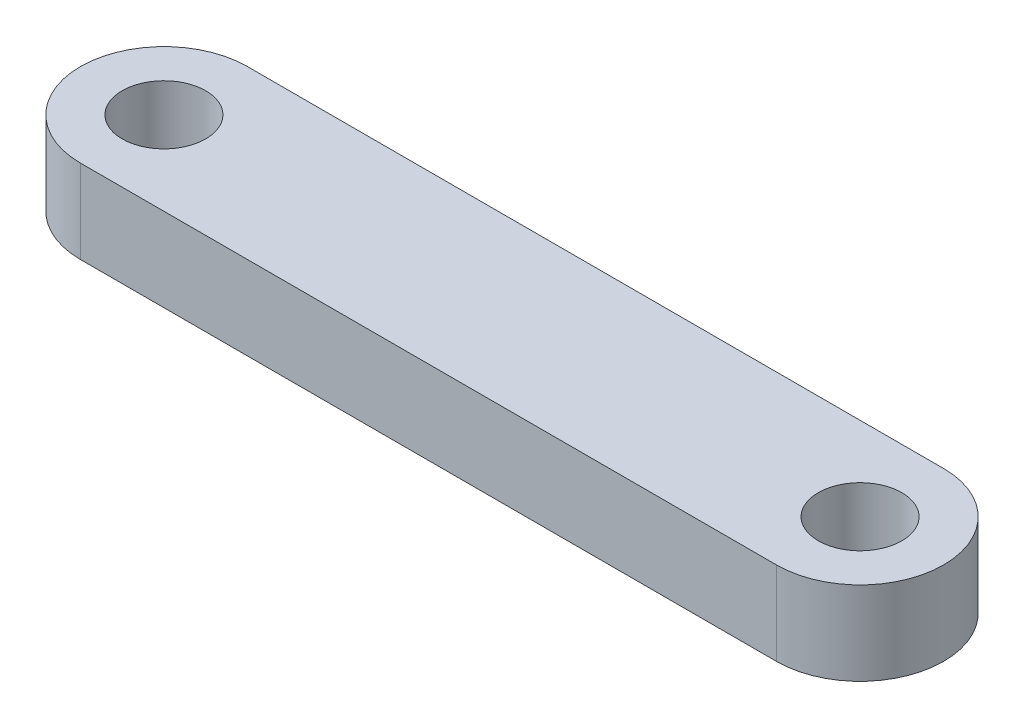
ISO-10303-21;
HEADER;
FILE_DESCRIPTION(('STEP AP214'),'2;1');
FILE_NAME('part.step','',(''),(''),'','','');
FILE_SCHEMA(('AUTOMOTIVE_DESIGN { 1 0 10303 214 1 1 1 1 }'));
ENDSEC;
DATA;
#1=APPLICATION_CONTEXT('core data for automotive mechanical design processes');
#2=APPLICATION_PROTOCOL_DEFINITION('international standard','automotive_design',2000,#1);
#3=PRODUCT_CONTEXT('',#1,'mechanical');
#4=PRODUCT('Part','Part','',(#3));
#5=PRODUCT_RELATED_PRODUCT_CATEGORY('part','',(#4));
#6=PRODUCT_DEFINITION_FORMATION('','',#4);
#7=PRODUCT_DEFINITION_CONTEXT('part definition',#1,'design');
#8=PRODUCT_DEFINITION('design','',#6,#7);
#9=PRODUCT_DEFINITION_SHAPE('','',#8);
#10=(LENGTH_UNIT() NAMED_UNIT(*) SI_UNIT(.MILLI.,.METRE.));
#11=(NAMED_UNIT(*) PLANE_ANGLE_UNIT() SI_UNIT($,.RADIAN.));
#12=(NAMED_UNIT(*) SI_UNIT($,.STERADIAN.) SOLID_ANGLE_UNIT());
#13=UNCERTAINTY_MEASURE_WITH_UNIT(LENGTH_MEASURE(1.E-05),#10,'distance_accuracy_value','');
#14=(GEOMETRIC_REPRESENTATION_CONTEXT(3) GLOBAL_UNCERTAINTY_ASSIGNED_CONTEXT((#13)) GLOBAL_UNIT_ASSIGNED_CONTEXT((#10,
#11,#12)) REPRESENTATION_CONTEXT('',''));
#15=CARTESIAN_POINT('',(0.,0.,0.));
#16=DIRECTION('',(0.,0.,1.));
#17=DIRECTION('',(1.,0.,0.));
#18=AXIS2_PLACEMENT_3D('',#15,#16,#17);
#19=CARTESIAN_POINT('',(0.,3.,-12.5));
#20=DIRECTION('',(0.,1.,0.));
#21=DIRECTION('',(0.,0.,1.));
#22=AXIS2_PLACEMENT_3D('',#19,#20,#21);
#23=PLANE('',#22);
#24=CARTESIAN_POINT('',(25.,3.,-12.5));
#25=DIRECTION('',(0.,1.,0.));
#26=DIRECTION('',(0.,0.,1.));
#27=AXIS2_PLACEMENT_3D('',#24,#25,#26);
#28=CIRCLE('',#27,1.5);
#29=CARTESIAN_POINT('',(25.,3.,-11.));
#30=VERTEX_POINT('',#29);
#31=EDGE_CURVE('E100',#30,#30,#28,.T.);
#32=ORIENTED_EDGE('',*,*,#31,.F.);
#33=EDGE_LOOP('',(#32));
#34=FACE_BOUND('',#33,.T.);
#35=CARTESIAN_POINT('',(0.,3.,-12.5));
#36=DIRECTION('',(0.,1.,0.));
#37=DIRECTION('',(0.,0.,1.));
#38=AXIS2_PLACEMENT_3D('',#35,#36,#37);
#39=CIRCLE('',#38,3.);
#40=CARTESIAN_POINT('',(0.,3.,-15.5));
#41=VERTEX_POINT('',#40);
#42=CARTESIAN_POINT('',(0.,3.,-9.5));
#43=VERTEX_POINT('',#42);
#44=EDGE_CURVE('E85',#41,#43,#39,.T.);
#45=ORIENTED_EDGE('',*,*,#44,.T.);
#46=DIRECTION('',(1.,0.,0.));
#47=VECTOR('',#46,1.);
#48=CARTESIAN_POINT('',(0.,3.,-9.5));
#49=LINE('',#48,#47);
#50=CARTESIAN_POINT('',(25.,3.,-9.5));
#51=VERTEX_POINT('',#50);
#52=EDGE_CURVE('E80',#43,#51,#49,.T.);
#53=ORIENTED_EDGE('',*,*,#52,.T.);
#54=CARTESIAN_POINT('',(25.,3.,-12.5));
#55=DIRECTION('',(0.,1.,0.));
#56=DIRECTION('',(0.,0.,1.));
#57=AXIS2_PLACEMENT_3D('',#54,#55,#56);
#58=CIRCLE('',#57,3.);
#59=CARTESIAN_POINT('',(25.,3.,-15.5));
#60=VERTEX_POINT('',#59);
#61=EDGE_CURVE('E83',#51,#60,#58,.T.);
#62=ORIENTED_EDGE('',*,*,#61,.T.);
#63=DIRECTION('',(-1.,0.,0.));
#64=VECTOR('',#63,1.);
#65=CARTESIAN_POINT('',(0.,3.,-15.5));
#66=LINE('',#65,#64);
#67=EDGE_CURVE('E50',#60,#41,#66,.T.);
#68=ORIENTED_EDGE('',*,*,#67,.T.);
#69=EDGE_LOOP('',(#45,#53,#62,#68));
#70=FACE_BOUND('',#69,.T.);
#71=CARTESIAN_POINT('',(0.,3.,-12.5));
#72=DIRECTION('',(0.,1.,0.));
#73=DIRECTION('',(0.,0.,1.));
#74=AXIS2_PLACEMENT_3D('',#71,#72,#73);
#75=CIRCLE('',#74,1.5);
#76=CARTESIAN_POINT('',(0.,3.,-11.));
#77=VERTEX_POINT('',#76);
#78=EDGE_CURVE('E115',#77,#77,#75,.T.);
#79=ORIENTED_EDGE('',*,*,#78,.F.);
#80=EDGE_LOOP('',(#79));
#81=FACE_BOUND('',#80,.T.);
#82=ADVANCED_FACE('F33',(#34,#70,#81),#23,.T.);
#83=CARTESIAN_POINT('',(0.,0.,-12.5));
#84=DIRECTION('',(0.,1.,0.));
#85=DIRECTION('',(0.,0.,1.));
#86=AXIS2_PLACEMENT_3D('',#83,#84,#85);
#87=PLANE('',#86);
#88=CARTESIAN_POINT('',(0.,0.,-12.5));
#89=DIRECTION('',(0.,1.,0.));
#90=DIRECTION('',(0.,0.,1.));
#91=AXIS2_PLACEMENT_3D('',#88,#89,#90);
#92=CIRCLE('',#91,3.);
#93=CARTESIAN_POINT('',(0.,0.,-15.5));
#94=VERTEX_POINT('',#93);
#95=CARTESIAN_POINT('',(0.,0.,-9.5));
#96=VERTEX_POINT('',#95);
#97=EDGE_CURVE('E97',#94,#96,#92,.T.);
#98=ORIENTED_EDGE('',*,*,#97,.F.);
#99=DIRECTION('',(-1.,0.,0.));
#100=VECTOR('',#99,1.);
#101=CARTESIAN_POINT('',(0.,0.,-15.5));
#102=LINE('',#101,#100);
#103=CARTESIAN_POINT('',(25.,0.,-15.5));
#104=VERTEX_POINT('',#103);
#105=EDGE_CURVE('E73',#104,#94,#102,.T.);
#106=ORIENTED_EDGE('',*,*,#105,.F.);
#107=CARTESIAN_POINT('',(25.,0.,-12.5));
#108=DIRECTION('',(0.,1.,0.));
#109=DIRECTION('',(0.,0.,1.));
#110=AXIS2_PLACEMENT_3D('',#107,#108,#109);
#111=CIRCLE('',#110,3.);
#112=CARTESIAN_POINT('',(25.,0.,-9.5));
#113=VERTEX_POINT('',#112);
#114=EDGE_CURVE('E67',#113,#104,#111,.T.);
#115=ORIENTED_EDGE('',*,*,#114,.F.);
#116=DIRECTION('',(1.,0.,0.));
#117=VECTOR('',#116,1.);
#118=CARTESIAN_POINT('',(0.,0.,-9.5));
#119=LINE('',#118,#117);
#120=EDGE_CURVE('E89',#96,#113,#119,.T.);
#121=ORIENTED_EDGE('',*,*,#120,.F.);
#122=EDGE_LOOP('',(#98,#106,#115,#121));
#123=FACE_BOUND('',#122,.T.);
#124=CARTESIAN_POINT('',(25.,0.,-12.5));
#125=DIRECTION('',(0.,1.,0.));
#126=DIRECTION('',(0.,0.,1.));
#127=AXIS2_PLACEMENT_3D('',#124,#125,#126);
#128=CIRCLE('',#127,1.5);
#129=CARTESIAN_POINT('',(25.,0.,-11.));
#130=VERTEX_POINT('',#129);
#131=EDGE_CURVE('E112',#130,#130,#128,.T.);
#132=ORIENTED_EDGE('',*,*,#131,.T.);
#133=EDGE_LOOP('',(#132));
#134=FACE_BOUND('',#133,.T.);
#135=CARTESIAN_POINT('',(0.,0.,-12.5));
#136=DIRECTION('',(0.,1.,0.));
#137=DIRECTION('',(0.,0.,1.));
#138=AXIS2_PLACEMENT_3D('',#135,#136,#137);
#139=CIRCLE('',#138,1.5);
#140=CARTESIAN_POINT('',(0.,0.,-11.));
#141=VERTEX_POINT('',#140);
#142=EDGE_CURVE('E118',#141,#141,#139,.T.);
#143=ORIENTED_EDGE('',*,*,#142,.T.);
#144=EDGE_LOOP('',(#143));
#145=FACE_BOUND('',#144,.T.);
#146=ADVANCED_FACE('F108',(#123,#134,#145),#87,.F.);
#147=CARTESIAN_POINT('',(0.,3.,-12.5));
#148=DIRECTION('',(0.,-1.,0.));
#149=DIRECTION('',(0.,0.,-1.));
#150=AXIS2_PLACEMENT_3D('',#147,#148,#149);
#151=CYLINDRICAL_SURFACE('',#150,3.);
#152=ORIENTED_EDGE('',*,*,#97,.T.);
#153=DIRECTION('',(0.,-1.,0.));
#154=VECTOR('',#153,1.);
#155=CARTESIAN_POINT('',(0.,3.,-9.5));
#156=LINE('',#155,#154);
#157=EDGE_CURVE('E11',#43,#96,#156,.T.);
#158=ORIENTED_EDGE('',*,*,#157,.F.);
#159=ORIENTED_EDGE('',*,*,#44,.F.);
#160=DIRECTION('',(0.,-1.,0.));
#161=VECTOR('',#160,1.);
#162=CARTESIAN_POINT('',(0.,3.,-15.5));
#163=LINE('',#162,#161);
#164=EDGE_CURVE('E93',#41,#94,#163,.T.);
#165=ORIENTED_EDGE('',*,*,#164,.T.);
#166=EDGE_LOOP('',(#152,#158,#159,#165));
#167=FACE_BOUND('',#166,.T.);
#168=ADVANCED_FACE('F35',(#167),#151,.T.);
#169=CARTESIAN_POINT('',(0.,3.,-9.5));
#170=DIRECTION('',(0.,0.,-1.));
#171=DIRECTION('',(-1.,0.,0.));
#172=AXIS2_PLACEMENT_3D('',#169,#170,#171);
#173=PLANE('',#172);
#174=ORIENTED_EDGE('',*,*,#120,.T.);
#175=DIRECTION('',(0.,-1.,0.));
#176=VECTOR('',#175,1.);
#177=CARTESIAN_POINT('',(25.,3.,-9.5));
#178=LINE('',#177,#176);
#179=EDGE_CURVE('E42',#51,#113,#178,.T.);
#180=ORIENTED_EDGE('',*,*,#179,.F.);
#181=ORIENTED_EDGE('',*,*,#52,.F.);
#182=ORIENTED_EDGE('',*,*,#157,.T.);
#183=EDGE_LOOP('',(#174,#180,#181,#182));
#184=FACE_BOUND('',#183,.T.);
#185=ADVANCED_FACE('F88',(#184),#173,.F.);
#186=CARTESIAN_POINT('',(25.,3.,-12.5));
#187=DIRECTION('',(0.,-1.,0.));
#188=DIRECTION('',(0.,0.,-1.));
#189=AXIS2_PLACEMENT_3D('',#186,#187,#188);
#190=CYLINDRICAL_SURFACE('',#189,3.);
#191=ORIENTED_EDGE('',*,*,#114,.T.);
#192=DIRECTION('',(0.,-1.,0.));
#193=VECTOR('',#192,1.);
#194=CARTESIAN_POINT('',(25.,3.,-15.5));
#195=LINE('',#194,#193);
#196=EDGE_CURVE('E90',#60,#104,#195,.T.);
#197=ORIENTED_EDGE('',*,*,#196,.F.);
#198=ORIENTED_EDGE('',*,*,#61,.F.);
#199=ORIENTED_EDGE('',*,*,#179,.T.);
#200=EDGE_LOOP('',(#191,#197,#198,#199));
#201=FACE_BOUND('',#200,.T.);
#202=ADVANCED_FACE('F91',(#201),#190,.T.);
#203=CARTESIAN_POINT('',(0.,3.,-15.5));
#204=DIRECTION('',(0.,0.,1.));
#205=DIRECTION('',(1.,0.,0.));
#206=AXIS2_PLACEMENT_3D('',#203,#204,#205);
#207=PLANE('',#206);
#208=ORIENTED_EDGE('',*,*,#105,.T.);
#209=ORIENTED_EDGE('',*,*,#164,.F.);
#210=ORIENTED_EDGE('',*,*,#67,.F.);
#211=ORIENTED_EDGE('',*,*,#196,.T.);
#212=EDGE_LOOP('',(#208,#209,#210,#211));
#213=FACE_BOUND('',#212,.T.);
#214=ADVANCED_FACE('F105',(#213),#207,.F.);
#215=CARTESIAN_POINT('',(25.,3.,-12.5));
#216=DIRECTION('',(0.,-1.,0.));
#217=DIRECTION('',(0.,0.,-1.));
#218=AXIS2_PLACEMENT_3D('',#215,#216,#217);
#219=CYLINDRICAL_SURFACE('',#218,1.5);
#220=ORIENTED_EDGE('',*,*,#31,.T.);
#221=EDGE_LOOP('',(#220));
#222=FACE_BOUND('',#221,.T.);
#223=ORIENTED_EDGE('',*,*,#131,.F.);
#224=EDGE_LOOP('',(#223));
#225=FACE_BOUND('',#224,.T.);
#226=ADVANCED_FACE('F135',(#222,#225),#219,.F.);
#227=CARTESIAN_POINT('',(0.,3.,-12.5));
#228=DIRECTION('',(0.,-1.,0.));
#229=DIRECTION('',(0.,0.,-1.));
#230=AXIS2_PLACEMENT_3D('',#227,#228,#229);
#231=CYLINDRICAL_SURFACE('',#230,1.5);
#232=ORIENTED_EDGE('',*,*,#78,.T.);
#233=EDGE_LOOP('',(#232));
#234=FACE_BOUND('',#233,.T.);
#235=ORIENTED_EDGE('',*,*,#142,.F.);
#236=EDGE_LOOP('',(#235));
#237=FACE_BOUND('',#236,.T.);
#238=ADVANCED_FACE('F124',(#234,#237),#231,.F.);
#239=CLOSED_SHELL('',(#82,#146,#168,#185,#202,#214,#226,#238));
#240=MANIFOLD_SOLID_BREP('B2',#239);
#241=ADVANCED_BREP_SHAPE_REPRESENTATION('',(#18,#240),#14);
#242=SHAPE_DEFINITION_REPRESENTATION(#9,#241);
ENDSEC;
END-ISO-10303-21;
